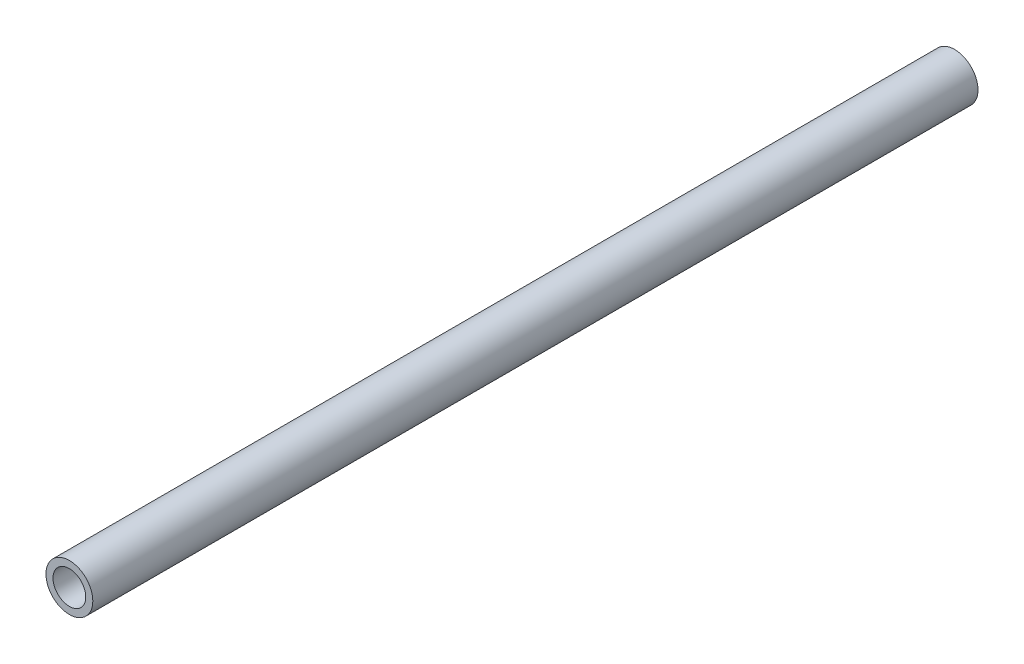
ISO-10303-21;
HEADER;
FILE_DESCRIPTION(('STEP AP214'),'2;1');
FILE_NAME('part.step','',(''),(''),'','','');
FILE_SCHEMA(('AUTOMOTIVE_DESIGN { 1 0 10303 214 1 1 1 1 }'));
ENDSEC;
DATA;
#1=APPLICATION_CONTEXT('core data for automotive mechanical design processes');
#2=APPLICATION_PROTOCOL_DEFINITION('international standard','automotive_design',2000,#1);
#3=PRODUCT_CONTEXT('',#1,'mechanical');
#4=PRODUCT('Part','Part','',(#3));
#5=PRODUCT_RELATED_PRODUCT_CATEGORY('part','',(#4));
#6=PRODUCT_DEFINITION_FORMATION('','',#4);
#7=PRODUCT_DEFINITION_CONTEXT('part definition',#1,'design');
#8=PRODUCT_DEFINITION('design','',#6,#7);
#9=PRODUCT_DEFINITION_SHAPE('','',#8);
#10=(LENGTH_UNIT() NAMED_UNIT(*) SI_UNIT(.MILLI.,.METRE.));
#11=(NAMED_UNIT(*) PLANE_ANGLE_UNIT() SI_UNIT($,.RADIAN.));
#12=(NAMED_UNIT(*) SI_UNIT($,.STERADIAN.) SOLID_ANGLE_UNIT());
#13=UNCERTAINTY_MEASURE_WITH_UNIT(LENGTH_MEASURE(1.E-05),#10,'distance_accuracy_value','');
#14=(GEOMETRIC_REPRESENTATION_CONTEXT(3) GLOBAL_UNCERTAINTY_ASSIGNED_CONTEXT((#13)) GLOBAL_UNIT_ASSIGNED_CONTEXT((#10,
#11,#12)) REPRESENTATION_CONTEXT('',''));
#15=CARTESIAN_POINT('',(0.,0.,0.));
#16=DIRECTION('',(0.,0.,1.));
#17=DIRECTION('',(1.,0.,0.));
#18=AXIS2_PLACEMENT_3D('',#15,#16,#17);
#19=CARTESIAN_POINT('',(0.,0.,600.));
#20=DIRECTION('',(0.,0.,1.));
#21=DIRECTION('',(1.,0.,0.));
#22=AXIS2_PLACEMENT_3D('',#19,#20,#21);
#23=PLANE('',#22);
#24=CARTESIAN_POINT('',(0.,0.,600.));
#25=DIRECTION('',(0.,0.,1.));
#26=DIRECTION('',(1.,0.,0.));
#27=AXIS2_PLACEMENT_3D('',#24,#25,#26);
#28=CIRCLE('',#27,15.875);
#29=CARTESIAN_POINT('',(15.875,0.,600.));
#30=VERTEX_POINT('',#29);
#31=EDGE_CURVE('E10',#30,#30,#28,.T.);
#32=ORIENTED_EDGE('',*,*,#31,.T.);
#33=EDGE_LOOP('',(#32));
#34=FACE_BOUND('',#33,.T.);
#35=CARTESIAN_POINT('',(0.,0.,600.));
#36=DIRECTION('',(0.,0.,1.));
#37=DIRECTION('',(1.,0.,0.));
#38=AXIS2_PLACEMENT_3D('',#35,#36,#37);
#39=CIRCLE('',#38,11.1);
#40=CARTESIAN_POINT('',(11.1,0.,600.));
#41=VERTEX_POINT('',#40);
#42=EDGE_CURVE('E48',#41,#41,#39,.T.);
#43=ORIENTED_EDGE('',*,*,#42,.F.);
#44=EDGE_LOOP('',(#43));
#45=FACE_BOUND('',#44,.T.);
#46=ADVANCED_FACE('F37',(#34,#45),#23,.T.);
#47=CARTESIAN_POINT('',(0.,0.,0.));
#48=DIRECTION('',(0.,0.,1.));
#49=DIRECTION('',(1.,0.,0.));
#50=AXIS2_PLACEMENT_3D('',#47,#48,#49);
#51=PLANE('',#50);
#52=CARTESIAN_POINT('',(0.,0.,0.));
#53=DIRECTION('',(0.,0.,1.));
#54=DIRECTION('',(1.,0.,0.));
#55=AXIS2_PLACEMENT_3D('',#52,#53,#54);
#56=CIRCLE('',#55,15.875);
#57=CARTESIAN_POINT('',(15.875,0.,0.));
#58=VERTEX_POINT('',#57);
#59=EDGE_CURVE('E41',#58,#58,#56,.T.);
#60=ORIENTED_EDGE('',*,*,#59,.F.);
#61=EDGE_LOOP('',(#60));
#62=FACE_BOUND('',#61,.T.);
#63=CARTESIAN_POINT('',(0.,0.,0.));
#64=DIRECTION('',(0.,0.,1.));
#65=DIRECTION('',(1.,0.,0.));
#66=AXIS2_PLACEMENT_3D('',#63,#64,#65);
#67=CIRCLE('',#66,11.1);
#68=CARTESIAN_POINT('',(11.1,0.,0.));
#69=VERTEX_POINT('',#68);
#70=EDGE_CURVE('E50',#69,#69,#67,.T.);
#71=ORIENTED_EDGE('',*,*,#70,.T.);
#72=EDGE_LOOP('',(#71));
#73=FACE_BOUND('',#72,.T.);
#74=ADVANCED_FACE('F60',(#62,#73),#51,.F.);
#75=CARTESIAN_POINT('',(0.,0.,600.));
#76=DIRECTION('',(0.,0.,-1.));
#77=DIRECTION('',(-1.,0.,0.));
#78=AXIS2_PLACEMENT_3D('',#75,#76,#77);
#79=CYLINDRICAL_SURFACE('',#78,15.875);
#80=ORIENTED_EDGE('',*,*,#31,.F.);
#81=EDGE_LOOP('',(#80));
#82=FACE_BOUND('',#81,.T.);
#83=ORIENTED_EDGE('',*,*,#59,.T.);
#84=EDGE_LOOP('',(#83));
#85=FACE_BOUND('',#84,.T.);
#86=ADVANCED_FACE('F39',(#82,#85),#79,.T.);
#87=CARTESIAN_POINT('',(0.,0.,600.));
#88=DIRECTION('',(0.,0.,-1.));
#89=DIRECTION('',(-1.,0.,0.));
#90=AXIS2_PLACEMENT_3D('',#87,#88,#89);
#91=CYLINDRICAL_SURFACE('',#90,11.1);
#92=ORIENTED_EDGE('',*,*,#42,.T.);
#93=EDGE_LOOP('',(#92));
#94=FACE_BOUND('',#93,.T.);
#95=ORIENTED_EDGE('',*,*,#70,.F.);
#96=EDGE_LOOP('',(#95));
#97=FACE_BOUND('',#96,.T.);
#98=ADVANCED_FACE('F56',(#94,#97),#91,.F.);
#99=CLOSED_SHELL('',(#46,#74,#86,#98));
#100=MANIFOLD_SOLID_BREP('B2',#99);
#101=ADVANCED_BREP_SHAPE_REPRESENTATION('',(#18,#100),#14);
#102=SHAPE_DEFINITION_REPRESENTATION(#9,#101);
ENDSEC;
END-ISO-10303-21;
